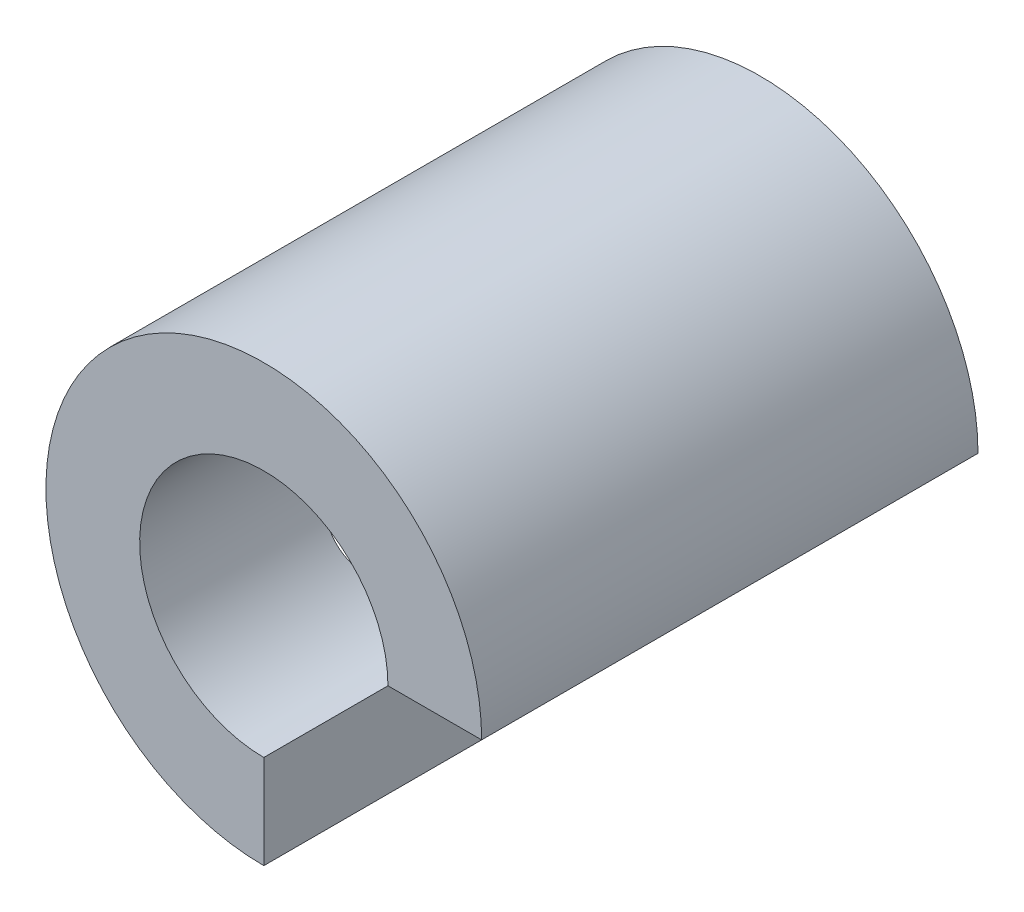
ISO-10303-21;
HEADER;
FILE_DESCRIPTION(('STEP AP214'),'2;1');
FILE_NAME('part.step','',(''),(''),'','','');
FILE_SCHEMA(('AUTOMOTIVE_DESIGN { 1 0 10303 214 1 1 1 1 }'));
ENDSEC;
DATA;
#1=APPLICATION_CONTEXT('core data for automotive mechanical design processes');
#2=APPLICATION_PROTOCOL_DEFINITION('international standard','automotive_design',2000,#1);
#3=PRODUCT_CONTEXT('',#1,'mechanical');
#4=PRODUCT('Part','Part','',(#3));
#5=PRODUCT_RELATED_PRODUCT_CATEGORY('part','',(#4));
#6=PRODUCT_DEFINITION_FORMATION('','',#4);
#7=PRODUCT_DEFINITION_CONTEXT('part definition',#1,'design');
#8=PRODUCT_DEFINITION('design','',#6,#7);
#9=PRODUCT_DEFINITION_SHAPE('','',#8);
#10=(LENGTH_UNIT() NAMED_UNIT(*) SI_UNIT(.MILLI.,.METRE.));
#11=(NAMED_UNIT(*) PLANE_ANGLE_UNIT() SI_UNIT($,.RADIAN.));
#12=(NAMED_UNIT(*) SI_UNIT($,.STERADIAN.) SOLID_ANGLE_UNIT());
#13=UNCERTAINTY_MEASURE_WITH_UNIT(LENGTH_MEASURE(1.E-05),#10,'distance_accuracy_value','');
#14=(GEOMETRIC_REPRESENTATION_CONTEXT(3) GLOBAL_UNCERTAINTY_ASSIGNED_CONTEXT((#13)) GLOBAL_UNIT_ASSIGNED_CONTEXT((#10,
#11,#12)) REPRESENTATION_CONTEXT('',''));
#15=CARTESIAN_POINT('',(0.,0.,0.));
#16=DIRECTION('',(0.,0.,1.));
#17=DIRECTION('',(1.,0.,0.));
#18=AXIS2_PLACEMENT_3D('',#15,#16,#17);
#19=CARTESIAN_POINT('',(0.,0.,2.54));
#20=DIRECTION('',(0.,0.,-1.));
#21=DIRECTION('',(-1.,0.,0.));
#22=AXIS2_PLACEMENT_3D('',#19,#20,#21);
#23=CYLINDRICAL_SURFACE('',#22,1.11496307408743);
#24=CARTESIAN_POINT('',(-0.650054968485564,-0.905853848325279,1.2662797260811));
#25=CARTESIAN_POINT('',(-0.650054399553323,-0.905854005474479,1.24475952003127));
#26=CARTESIAN_POINT('',(-0.651586031238395,-0.904760918163993,1.22324239554398));
#27=CARTESIAN_POINT('',(-0.657596895678824,-0.900401316282277,1.18085164500018));
#28=CARTESIAN_POINT('',(-0.662076290361271,-0.89713468231325,1.15997805436035));
#29=CARTESIAN_POINT('',(-0.673661198554835,-0.888467734145884,1.11949670803127));
#30=CARTESIAN_POINT('',(-0.680760968264163,-0.883072084925903,1.0998862930984));
#31=CARTESIAN_POINT('',(-0.69716165625322,-0.870181994514345,1.06234878815626));
#32=CARTESIAN_POINT('',(-0.706463159473504,-0.8626869954856,1.04442214725072));
#33=CARTESIAN_POINT('',(-0.727200658964764,-0.845288103339899,1.00995980579885));
#34=CARTESIAN_POINT('',(-0.738708004467765,-0.835298736114703,0.993510170422486));
#35=CARTESIAN_POINT('',(-0.763026931016561,-0.813143804512611,0.963246523332104));
#36=CARTESIAN_POINT('',(-0.775838755609098,-0.800977833440746,0.949433005170968));
#37=CARTESIAN_POINT('',(-0.802598776222119,-0.77417481542172,0.924430560730324));
#38=CARTESIAN_POINT('',(-0.816569616348962,-0.75947418709649,0.913333596720354));
#39=CARTESIAN_POINT('',(-0.844664459209266,-0.728098323125537,0.894691341039191));
#40=CARTESIAN_POINT('',(-0.858788413060455,-0.711423701747294,0.887144948117816));
#41=CARTESIAN_POINT('',(-0.886035537527678,-0.677158589964064,0.876115167773703));
#42=CARTESIAN_POINT('',(-0.899176230781452,-0.659629720668769,0.872483956547606));
#43=CARTESIAN_POINT('',(-0.924548130244183,-0.623569438322725,0.868915673409587));
#44=CARTESIAN_POINT('',(-0.936779602072252,-0.605038320822596,0.868977518331309));
#45=CARTESIAN_POINT('',(-0.959432900538969,-0.568396671746801,0.872703881598774));
#46=CARTESIAN_POINT('',(-0.969911139348529,-0.550304298956718,0.876207435131451));
#47=CARTESIAN_POINT('',(-0.989479941943483,-0.51428821320269,0.886449158577885));
#48=CARTESIAN_POINT('',(-0.998570408889185,-0.496364512090589,0.89318755408532));
#49=CARTESIAN_POINT('',(-1.01539230031323,-0.460988566176963,0.909791273344588));
#50=CARTESIAN_POINT('',(-1.02310294294199,-0.443546418841754,0.919699005147482));
#51=CARTESIAN_POINT('',(-1.03702903125615,-0.409932857726817,0.942323924702395));
#52=CARTESIAN_POINT('',(-1.04324402200571,-0.39376183159153,0.955041965021574));
#53=CARTESIAN_POINT('',(-1.05456884807807,-0.362381380385495,0.983719087545649));
#54=CARTESIAN_POINT('',(-1.05960230362103,-0.347268873688827,0.999814593365299));
#55=CARTESIAN_POINT('',(-1.06828234423852,-0.319572600681712,1.03438672895389));
#56=CARTESIAN_POINT('',(-1.07192864861677,-0.306989346419602,1.05286383963967));
#57=CARTESIAN_POINT('',(-1.07806866693969,-0.284688126746987,1.09211443189409));
#58=CARTESIAN_POINT('',(-1.08054012941429,-0.275026649679612,1.11292367103382));
#59=CARTESIAN_POINT('',(-1.08439812691998,-0.259401057128807,1.15597983739476));
#60=CARTESIAN_POINT('',(-1.08578519448416,-0.253435127106685,1.17822605311581));
#61=CARTESIAN_POINT('',(-1.08754685946107,-0.245762669436232,1.22231999731639));
#62=CARTESIAN_POINT('',(-1.08796911386227,-0.243855985728074,1.24413097894656));
#63=CARTESIAN_POINT('',(-1.0879777238045,-0.243818077261686,1.28775374539174));
#64=CARTESIAN_POINT('',(-1.0875642598922,-0.24568603703815,1.3095655290155));
#65=CARTESIAN_POINT('',(-1.08590188279323,-0.252927668087009,1.3516339741616));
#66=CARTESIAN_POINT('',(-1.0846879857948,-0.258154180067101,1.37191771176143));
#67=CARTESIAN_POINT('',(-1.08137442248345,-0.27169888462339,1.41134681907417));
#68=CARTESIAN_POINT('',(-1.07927458581435,-0.280017671772521,1.43049196904129));
#69=CARTESIAN_POINT('',(-1.07397484342799,-0.299712968692054,1.46784273172349));
#70=CARTESIAN_POINT('',(-1.07073908132697,-0.311186116718256,1.48599218404534));
#71=CARTESIAN_POINT('',(-1.06302962298764,-0.336580618012825,1.52019743792302));
#72=CARTESIAN_POINT('',(-1.05855551365684,-0.350502787669171,1.53625253820301));
#73=CARTESIAN_POINT('',(-1.04792572945384,-0.38114475456781,1.56674574992975));
#74=CARTESIAN_POINT('',(-1.04168982628784,-0.397977654888748,1.58104269651956));
#75=CARTESIAN_POINT('',(-1.02752980545295,-0.433226737523331,1.60651370342622));
#76=CARTESIAN_POINT('',(-1.01960571793224,-0.451642891559183,1.61768781950343));
#77=CARTESIAN_POINT('',(-1.00206856544476,-0.489316052960541,1.63650592157421));
#78=CARTESIAN_POINT('',(-0.992464537528204,-0.508568166538103,1.64416803936591));
#79=CARTESIAN_POINT('',(-0.97163319705397,-0.547315688907371,1.65575390192464));
#80=CARTESIAN_POINT('',(-0.960406565247398,-0.566810992551993,1.65967920922837));
#81=CARTESIAN_POINT('',(-0.937222041012344,-0.60433276497677,1.66352431579841));
#82=CARTESIAN_POINT('',(-0.925334542850654,-0.622382287970191,1.66364557100399));
#83=CARTESIAN_POINT('',(-0.900688591524331,-0.657543545457394,1.66038734106127));
#84=CARTESIAN_POINT('',(-0.88793022659965,-0.674655374646518,1.65700821009671));
#85=CARTESIAN_POINT('',(-0.862252827564204,-0.707165908746548,1.64698351184249));
#86=CARTESIAN_POINT('',(-0.849342245659756,-0.722592237614001,1.64040530924017));
#87=CARTESIAN_POINT('',(-0.823578569646634,-0.751825129426127,1.62423388765974));
#88=CARTESIAN_POINT('',(-0.810725486754628,-0.765631388544385,1.61464010437945));
#89=CARTESIAN_POINT('',(-0.785054619007093,-0.791949112132636,1.59227175959098));
#90=CARTESIAN_POINT('',(-0.772258709856349,-0.804386923126801,1.5793855468749));
#91=CARTESIAN_POINT('',(-0.747784172767926,-0.827189082349729,1.55098048148509));
#92=CARTESIAN_POINT('',(-0.73610592758641,-0.837552721572302,1.53546073193793));
#93=CARTESIAN_POINT('',(-0.71389881372581,-0.856571637306029,1.5013724396154));
#94=CARTESIAN_POINT('',(-0.703448200317574,-0.865125594690613,1.48269600392123));
#95=CARTESIAN_POINT('',(-0.684954563392092,-0.879840992942437,1.44331378988596));
#96=CARTESIAN_POINT('',(-0.676911352036613,-0.886002620483051,1.42260817003995));
#97=CARTESIAN_POINT('',(-0.66375984215327,-0.895898436703641,1.37968937473025));
#98=CARTESIAN_POINT('',(-0.658656193440444,-0.899628780786667,1.35747387263606));
#99=CARTESIAN_POINT('',(-0.65180488727667,-0.904605790779123,1.31226405711102));
#100=CARTESIAN_POINT('',(-0.650055576285683,-0.90585368044008,1.28927013309976));
#101=CARTESIAN_POINT('',(-0.650054968485564,-0.905853848325279,1.2662797260811));
#102=B_SPLINE_CURVE_WITH_KNOTS('',3,(#24,#25,#26,#27,#28,#29,#30,#31,#32,#33,#34,#35,#36,#37,
#38,#39,#40,#41,#42,#43,#44,#45,#46,#47,#48,#49,#50,#51,#52,#53,#54,#55,#56,#57,#58,#59,#60,#61,
#62,#63,#64,#65,#66,#67,#68,#69,#70,#71,#72,#73,#74,#75,#76,#77,#78,#79,#80,#81,#82,#83,#84,#85,
#86,#87,#88,#89,#90,#91,#92,#93,#94,#95,#96,#97,#98,#99,#100,#101),.UNSPECIFIED.,.T.,.F.,(4,2,2,
2,2,2,2,2,2,2,2,2,2,2,2,2,2,2,2,2,2,2,2,2,2,2,2,2,2,2,2,2,2,2,2,2,2,2,4),(0.,0.0644752287288314,
0.128953999519144,0.193292265693649,0.257647644013652,0.324616832542832,0.391598547251718,
0.460605067568644,0.529590170592666,0.595868074877446,0.66212654007423,0.725426892598957,
0.788731660249532,0.852921655809699,0.917131151577793,0.984756432423906,1.05239539028078,
1.12126887735278,1.19010852021351,1.25546666171818,1.32081068490968,1.38347051209786,
1.44614239355755,1.51100294322,1.57588515543771,1.64440579832544,1.71292521765046,
1.7810867850289,1.84921983830627,1.91373822922128,1.97825009253293,2.04145874316272,
2.10467922900418,2.17042251471574,2.23618823496415,2.30499904371171,2.3738044820758,
2.44271846042553,2.51159845849176),.UNSPECIFIED.);
#103=CARTESIAN_POINT('',(-0.650054968485564,-0.905853848325279,1.2662797260811));
#104=VERTEX_POINT('',#103);
#105=EDGE_CURVE('E11',#104,#104,#102,.T.);
#106=ORIENTED_EDGE('',*,*,#105,.T.);
#107=EDGE_LOOP('',(#106));
#108=FACE_BOUND('',#107,.T.);
#109=CARTESIAN_POINT('',(0.,0.,0.));
#110=DIRECTION('',(0.,0.,1.));
#111=DIRECTION('',(1.,0.,0.));
#112=AXIS2_PLACEMENT_3D('',#109,#110,#111);
#113=CIRCLE('',#112,1.11496307408743);
#114=CARTESIAN_POINT('',(1.11496307408743,0.,0.));
#115=VERTEX_POINT('',#114);
#116=CARTESIAN_POINT('',(0.,-1.11496307408743,0.));
#117=VERTEX_POINT('',#116);
#118=EDGE_CURVE('E109',#115,#117,#113,.T.);
#119=ORIENTED_EDGE('',*,*,#118,.T.);
#120=DIRECTION('',(0.,0.,-1.));
#121=VECTOR('',#120,1.);
#122=CARTESIAN_POINT('',(0.,-1.11496307408743,2.54));
#123=LINE('',#122,#121);
#124=CARTESIAN_POINT('',(0.,-1.11496307408743,2.54));
#125=VERTEX_POINT('',#124);
#126=EDGE_CURVE('E51',#125,#117,#123,.T.);
#127=ORIENTED_EDGE('',*,*,#126,.F.);
#128=CARTESIAN_POINT('',(0.,0.,2.54));
#129=DIRECTION('',(0.,0.,1.));
#130=DIRECTION('',(1.,0.,0.));
#131=AXIS2_PLACEMENT_3D('',#128,#129,#130);
#132=CIRCLE('',#131,1.11496307408743);
#133=CARTESIAN_POINT('',(1.11496307408743,0.,2.54));
#134=VERTEX_POINT('',#133);
#135=EDGE_CURVE('E95',#134,#125,#132,.T.);
#136=ORIENTED_EDGE('',*,*,#135,.F.);
#137=DIRECTION('',(0.,0.,-1.));
#138=VECTOR('',#137,1.);
#139=CARTESIAN_POINT('',(1.11496307408743,0.,2.54));
#140=LINE('',#139,#138);
#141=EDGE_CURVE('E105',#134,#115,#140,.T.);
#142=ORIENTED_EDGE('',*,*,#141,.T.);
#143=EDGE_LOOP('',(#119,#127,#136,#142));
#144=FACE_BOUND('',#143,.T.);
#145=ADVANCED_FACE('F38',(#108,#144),#23,.T.);
#146=CARTESIAN_POINT('',(0.,-1.11496307408743,2.54));
#147=DIRECTION('',(-1.,0.,0.));
#148=DIRECTION('',(0.,0.,1.));
#149=AXIS2_PLACEMENT_3D('',#146,#147,#148);
#150=PLANE('',#149);
#151=DIRECTION('',(0.,1.,0.));
#152=VECTOR('',#151,1.);
#153=CARTESIAN_POINT('',(0.,-1.11496307408743,0.));
#154=LINE('',#153,#152);
#155=CARTESIAN_POINT('',(0.,-0.635351917,0.));
#156=VERTEX_POINT('',#155);
#157=EDGE_CURVE('E100',#117,#156,#154,.T.);
#158=ORIENTED_EDGE('',*,*,#157,.T.);
#159=DIRECTION('',(0.,0.,-1.));
#160=VECTOR('',#159,1.);
#161=CARTESIAN_POINT('',(0.,-0.635351917,2.54));
#162=LINE('',#161,#160);
#163=CARTESIAN_POINT('',(0.,-0.635351917,2.54));
#164=VERTEX_POINT('',#163);
#165=EDGE_CURVE('E98',#164,#156,#162,.T.);
#166=ORIENTED_EDGE('',*,*,#165,.F.);
#167=DIRECTION('',(0.,1.,0.));
#168=VECTOR('',#167,1.);
#169=CARTESIAN_POINT('',(0.,-1.11496307408743,2.54));
#170=LINE('',#169,#168);
#171=EDGE_CURVE('E90',#125,#164,#170,.T.);
#172=ORIENTED_EDGE('',*,*,#171,.F.);
#173=ORIENTED_EDGE('',*,*,#126,.T.);
#174=EDGE_LOOP('',(#158,#166,#172,#173));
#175=FACE_BOUND('',#174,.T.);
#176=ADVANCED_FACE('F99',(#175),#150,.F.);
#177=CARTESIAN_POINT('',(0.,0.,2.54));
#178=DIRECTION('',(0.,0.,-1.));
#179=DIRECTION('',(-1.,0.,0.));
#180=AXIS2_PLACEMENT_3D('',#177,#178,#179);
#181=CYLINDRICAL_SURFACE('',#180,0.635351917);
#182=CARTESIAN_POINT('',(-0.194846151008928,-0.604737162635621,1.2662797260811));
#183=CARTESIAN_POINT('',(-0.1948493285247,-0.604737226254664,1.28600575579285));
#184=CARTESIAN_POINT('',(-0.196664481329038,-0.604160529559254,1.30576278995406));
#185=CARTESIAN_POINT('',(-0.203691420444811,-0.601825946138133,1.3446114117425));
#186=CARTESIAN_POINT('',(-0.208912456860977,-0.600064842253698,1.36370103754873));
#187=CARTESIAN_POINT('',(-0.222105971945253,-0.595305962604907,1.40053474752498));
#188=CARTESIAN_POINT('',(-0.230054591058662,-0.592318868190438,1.41828892372852));
#189=CARTESIAN_POINT('',(-0.248071875713025,-0.585001530168175,1.45236861671032));
#190=CARTESIAN_POINT('',(-0.258140594883913,-0.580671252581983,1.46869409733358));
#191=CARTESIAN_POINT('',(-0.281289043059895,-0.569853152987441,1.50185852230062));
#192=CARTESIAN_POINT('',(-0.294591449621908,-0.563153986732719,1.51847317786389));
#193=CARTESIAN_POINT('',(-0.32250805106644,-0.547645923756379,1.54948841358866));
#194=CARTESIAN_POINT('',(-0.337123370708368,-0.53883520710482,1.5638870661161));
#195=CARTESIAN_POINT('',(-0.368846457462,-0.517715505738222,1.59178047721952));
#196=CARTESIAN_POINT('',(-0.386042390152628,-0.505112971994385,1.60495743045806));
#197=CARTESIAN_POINT('',(-0.420390706822426,-0.476902250429657,1.62765367704406));
#198=CARTESIAN_POINT('',(-0.43754311708721,-0.461297058932642,1.63717658859511));
#199=CARTESIAN_POINT('',(-0.469153481863624,-0.428981177075799,1.65125280539326));
#200=CARTESIAN_POINT('',(-0.483708151000276,-0.412543811391465,1.65621266537083));
#201=CARTESIAN_POINT('',(-0.511297776841926,-0.377805124872958,1.66240594988504));
#202=CARTESIAN_POINT('',(-0.524334314853727,-0.359505781424192,1.66364328584126));
#203=CARTESIAN_POINT('',(-0.546714633530162,-0.324271190370245,1.66240399741652));
#204=CARTESIAN_POINT('',(-0.556319172386047,-0.307481965423775,1.66040304434594));
#205=CARTESIAN_POINT('',(-0.573767139794075,-0.273545710998305,1.65366237818873));
#206=CARTESIAN_POINT('',(-0.581610435171564,-0.256398654569306,1.64892245809461));
#207=CARTESIAN_POINT('',(-0.595508865946396,-0.222222688017598,1.63690967702954));
#208=CARTESIAN_POINT('',(-0.601559264250036,-0.205194204946341,1.62963021465531));
#209=CARTESIAN_POINT('',(-0.611948173984357,-0.171751323366705,1.61281090276224));
#210=CARTESIAN_POINT('',(-0.616286294080544,-0.155337066012227,1.60327053731926));
#211=CARTESIAN_POINT('',(-0.623891977582648,-0.121520611414023,1.58086937042636));
#212=CARTESIAN_POINT('',(-0.626959269312585,-0.104249474044431,1.56774316474681));
#213=CARTESIAN_POINT('',(-0.631542214722298,-0.0714270777299253,1.53922795840137));
#214=CARTESIAN_POINT('',(-0.633055589425079,-0.0558783746171687,1.52383567198991));
#215=CARTESIAN_POINT('',(-0.635064748092717,-0.0251306714710348,1.48886590718733));
#216=CARTESIAN_POINT('',(-0.635402126701693,-0.0102415962981704,1.46900441534594));
#217=CARTESIAN_POINT('',(-0.635289627742919,0.0157821377498787,1.42696357319019));
#218=CARTESIAN_POINT('',(-0.634841209124868,0.0269237086590192,1.4047885900878));
#219=CARTESIAN_POINT('',(-0.633988365080569,0.0421039631203823,1.3646850650241));
#220=CARTESIAN_POINT('',(-0.633603350414115,0.0472398230914708,1.34717215057947));
#221=CARTESIAN_POINT('',(-0.633021055733301,0.0544992847831617,1.31153736757629));
#222=CARTESIAN_POINT('',(-0.632823519919328,0.0566269928296252,1.29341636378246));
#223=CARTESIAN_POINT('',(-0.632729012422419,0.0576753349353923,1.25703817761851));
#224=CARTESIAN_POINT('',(-0.632832725284769,0.0565886646686272,1.23878077927609));
#225=CARTESIAN_POINT('',(-0.63328267950612,0.0513002354534658,1.20272140896679));
#226=CARTESIAN_POINT('',(-0.633629121613916,0.0470958978756746,1.18491982662256));
#227=CARTESIAN_POINT('',(-0.63435339229935,0.0360221132757095,1.15050349952061));
#228=CARTESIAN_POINT('',(-0.634730619268511,0.0291970907950828,1.13387416801364));
#229=CARTESIAN_POINT('',(-0.635262386517908,0.0132999623918932,1.10173179575687));
#230=CARTESIAN_POINT('',(-0.63541684758465,0.00422705848665499,1.08621915395362));
#231=CARTESIAN_POINT('',(-0.635217105230522,-0.0176845819263577,1.05361627152174));
#232=CARTESIAN_POINT('',(-0.634760528210075,-0.0309113789844088,1.03678744580905));
#233=CARTESIAN_POINT('',(-0.632725279123549,-0.0594654065205735,1.00507681929089));
#234=CARTESIAN_POINT('',(-0.63114543850075,-0.0747948109737421,0.990197065255949));
#235=CARTESIAN_POINT('',(-0.626098899909536,-0.109681698985718,0.960386713662761));
#236=CARTESIAN_POINT('',(-0.622370967781898,-0.12952334947712,0.945828156169959));
#237=CARTESIAN_POINT('',(-0.612357759751071,-0.17069857550121,0.920069119572753));
#238=CARTESIAN_POINT('',(-0.606073694092659,-0.192031441039778,0.90886705563244));
#239=CARTESIAN_POINT('',(-0.591066060953894,-0.234051399291165,0.890921396458448));
#240=CARTESIAN_POINT('',(-0.582511378020177,-0.254700504889676,0.883950726062485));
#241=CARTESIAN_POINT('',(-0.562805396503281,-0.295697284334827,0.873902756792153));
#242=CARTESIAN_POINT('',(-0.551657706928367,-0.316045335708575,0.870820084460949));
#243=CARTESIAN_POINT('',(-0.528897499629215,-0.352609981251758,0.868914859085197));
#244=CARTESIAN_POINT('',(-0.517595692832943,-0.36899345892517,0.869531348013088));
#245=CARTESIAN_POINT('',(-0.493709260687213,-0.400389751691527,0.87370864953008));
#246=CARTESIAN_POINT('',(-0.481124692333298,-0.415402627626786,0.877269331353025));
#247=CARTESIAN_POINT('',(-0.455598404335698,-0.443223286651017,0.886975182063277));
#248=CARTESIAN_POINT('',(-0.442683878528107,-0.456089174395428,0.893027194576167));
#249=CARTESIAN_POINT('',(-0.416547615903161,-0.480078264070918,0.907451989239276));
#250=CARTESIAN_POINT('',(-0.40332582742835,-0.491201170499636,0.915825164250916));
#251=CARTESIAN_POINT('',(-0.375628433740076,-0.512751762698658,0.935615692822953));
#252=CARTESIAN_POINT('',(-0.361165265359601,-0.522987188421307,0.947258925747935));
#253=CARTESIAN_POINT('',(-0.332903688241739,-0.541417115707017,0.972775702743514));
#254=CARTESIAN_POINT('',(-0.31910605343154,-0.549609285288671,0.986651765723949));
#255=CARTESIAN_POINT('',(-0.290821957839372,-0.565146575355101,1.01854888594215));
#256=CARTESIAN_POINT('',(-0.276522172303979,-0.572200083766184,1.03687907729811));
#257=CARTESIAN_POINT('',(-0.250428386286494,-0.584091982396444,1.07590523880264));
#258=CARTESIAN_POINT('',(-0.238632989312035,-0.58893160886378,1.09659988053553));
#259=CARTESIAN_POINT('',(-0.220859576999811,-0.595787834556966,1.13523223306301));
#260=CARTESIAN_POINT('',(-0.214172634562385,-0.598191262245331,1.15277484443057));
#261=CARTESIAN_POINT('',(-0.203583878451038,-0.601878620822916,1.18876800561649));
#262=CARTESIAN_POINT('',(-0.199673240704329,-0.603166101492796,1.20721547778464));
#263=CARTESIAN_POINT('',(-0.196522719220105,-0.604194818491947,1.2325601907809));
#264=CARTESIAN_POINT('',(-0.195895577346282,-0.60439823004598,1.23928536596286));
#265=CARTESIAN_POINT('',(-0.19505669690726,-0.604669408188814,1.25276571810845));
#266=CARTESIAN_POINT('',(-0.194845062281498,-0.604737140837524,1.25952090215538));
#267=CARTESIAN_POINT('',(-0.194846151008928,-0.604737162635621,1.2662797260811));
#268=B_SPLINE_CURVE_WITH_KNOTS('',3,(#182,#183,#184,#185,#186,#187,#188,#189,#190,#191,#192,
#193,#194,#195,#196,#197,#198,#199,#200,#201,#202,#203,#204,#205,#206,#207,#208,#209,#210,#211,
#212,#213,#214,#215,#216,#217,#218,#219,#220,#221,#222,#223,#224,#225,#226,#227,#228,#229,#230,
#231,#232,#233,#234,#235,#236,#237,#238,#239,#240,#241,#242,#243,#244,#245,#246,#247,#248,#249,
#250,#251,#252,#253,#254,#255,#256,#257,#258,#259,#260,#261,#262,#263,#264,#265,#266,#267),
.UNSPECIFIED.,.T.,.F.,(4,2,2,2,2,2,2,2,2,2,2,2,2,2,2,2,2,2,2,2,2,2,2,2,2,2,2,2,2,2,2,2,2,2,2,2,
2,2,2,2,2,2,4),(0.,0.059147070201188,0.118455451640614,0.177257726612126,0.236061489221446,
0.30274423404711,0.369484660259717,0.444264470593809,0.518970042276073,0.586086917355289,
0.653133245110627,0.711191039012886,0.769253221419674,0.827467471992465,0.885695019511683,
0.951165002821941,1.01673086794911,1.09084549391966,1.16482266079255,1.21935760214584,
1.27381802759026,1.32840230344544,1.38303177650064,1.43677339767851,1.49053412417191,
1.55452372446832,1.61857999219218,1.69287510431371,1.76713508102305,1.83694197523095,
1.90665228584003,1.96608744379644,2.02551996208552,2.08290723610966,2.14030422898179,
2.20366386275887,2.26709548176,2.33965658773493,2.41217712543803,2.46874310402602,
2.52512848122914,2.54538925723834,2.56565510084976),.UNSPECIFIED.);
#269=CARTESIAN_POINT('',(-0.194846151008928,-0.604737162635621,1.2662797260811));
#270=VERTEX_POINT('',#269);
#271=EDGE_CURVE('E112',#270,#270,#268,.T.);
#272=ORIENTED_EDGE('',*,*,#271,.T.);
#273=EDGE_LOOP('',(#272));
#274=FACE_BOUND('',#273,.T.);
#275=CARTESIAN_POINT('',(0.,0.,0.));
#276=DIRECTION('',(0.,0.,-1.));
#277=DIRECTION('',(1.,0.,0.));
#278=AXIS2_PLACEMENT_3D('',#275,#276,#277);
#279=CIRCLE('',#278,0.635351917);
#280=CARTESIAN_POINT('',(0.635351917,0.,0.));
#281=VERTEX_POINT('',#280);
#282=EDGE_CURVE('E76',#156,#281,#279,.T.);
#283=ORIENTED_EDGE('',*,*,#282,.T.);
#284=DIRECTION('',(0.,0.,-1.));
#285=VECTOR('',#284,1.);
#286=CARTESIAN_POINT('',(0.635351917,0.,2.54));
#287=LINE('',#286,#285);
#288=CARTESIAN_POINT('',(0.635351917,0.,2.54));
#289=VERTEX_POINT('',#288);
#290=EDGE_CURVE('E101',#289,#281,#287,.T.);
#291=ORIENTED_EDGE('',*,*,#290,.F.);
#292=CARTESIAN_POINT('',(0.,0.,2.54));
#293=DIRECTION('',(0.,0.,-1.));
#294=DIRECTION('',(1.,0.,0.));
#295=AXIS2_PLACEMENT_3D('',#292,#293,#294);
#296=CIRCLE('',#295,0.635351917);
#297=EDGE_CURVE('E93',#164,#289,#296,.T.);
#298=ORIENTED_EDGE('',*,*,#297,.F.);
#299=ORIENTED_EDGE('',*,*,#165,.T.);
#300=EDGE_LOOP('',(#283,#291,#298,#299));
#301=FACE_BOUND('',#300,.T.);
#302=ADVANCED_FACE('F103',(#274,#301),#181,.F.);
#303=CARTESIAN_POINT('',(1.11496307408743,0.,2.54));
#304=DIRECTION('',(0.,1.,0.));
#305=DIRECTION('',(0.,0.,1.));
#306=AXIS2_PLACEMENT_3D('',#303,#304,#305);
#307=PLANE('',#306);
#308=DIRECTION('',(1.,0.,0.));
#309=VECTOR('',#308,1.);
#310=CARTESIAN_POINT('',(1.11496307408743,0.,0.));
#311=LINE('',#310,#309);
#312=EDGE_CURVE('E82',#281,#115,#311,.T.);
#313=ORIENTED_EDGE('',*,*,#312,.T.);
#314=ORIENTED_EDGE('',*,*,#141,.F.);
#315=DIRECTION('',(1.,0.,0.));
#316=VECTOR('',#315,1.);
#317=CARTESIAN_POINT('',(1.11496307408743,0.,2.54));
#318=LINE('',#317,#316);
#319=EDGE_CURVE('E59',#289,#134,#318,.T.);
#320=ORIENTED_EDGE('',*,*,#319,.F.);
#321=ORIENTED_EDGE('',*,*,#290,.T.);
#322=EDGE_LOOP('',(#313,#314,#320,#321));
#323=FACE_BOUND('',#322,.T.);
#324=ADVANCED_FACE('F129',(#323),#307,.F.);
#325=CARTESIAN_POINT('',(0.,0.,2.54));
#326=DIRECTION('',(0.,0.,1.));
#327=DIRECTION('',(1.,0.,0.));
#328=AXIS2_PLACEMENT_3D('',#325,#326,#327);
#329=PLANE('',#328);
#330=ORIENTED_EDGE('',*,*,#135,.T.);
#331=ORIENTED_EDGE('',*,*,#171,.T.);
#332=ORIENTED_EDGE('',*,*,#297,.T.);
#333=ORIENTED_EDGE('',*,*,#319,.T.);
#334=EDGE_LOOP('',(#330,#331,#332,#333));
#335=FACE_BOUND('',#334,.T.);
#336=ADVANCED_FACE('F91',(#335),#329,.T.);
#337=CARTESIAN_POINT('',(0.,0.,0.));
#338=DIRECTION('',(0.,0.,1.));
#339=DIRECTION('',(1.,0.,0.));
#340=AXIS2_PLACEMENT_3D('',#337,#338,#339);
#341=PLANE('',#340);
#342=ORIENTED_EDGE('',*,*,#118,.F.);
#343=ORIENTED_EDGE('',*,*,#312,.F.);
#344=ORIENTED_EDGE('',*,*,#282,.F.);
#345=ORIENTED_EDGE('',*,*,#157,.F.);
#346=EDGE_LOOP('',(#342,#343,#344,#345));
#347=FACE_BOUND('',#346,.T.);
#348=ADVANCED_FACE('F120',(#347),#341,.F.);
#349=CARTESIAN_POINT('',(-0.929920595294194,-0.615134410536573,1.2662797260811));
#350=DIRECTION('',(-0.834037123655699,-0.551708325443915,0.));
#351=DIRECTION('',(0.551708325443915,-0.834037123655699,0.));
#352=AXIS2_PLACEMENT_3D('',#349,#350,#351);
#353=CYLINDRICAL_SURFACE('',#352,0.396874999999994);
#354=ORIENTED_EDGE('',*,*,#105,.F.);
#355=EDGE_LOOP('',(#354));
#356=FACE_BOUND('',#355,.T.);
#357=ORIENTED_EDGE('',*,*,#271,.F.);
#358=EDGE_LOOP('',(#357));
#359=FACE_BOUND('',#358,.T.);
#360=ADVANCED_FACE('F122',(#356,#359),#353,.F.);
#361=CLOSED_SHELL('',(#145,#176,#302,#324,#336,#348,#360));
#362=MANIFOLD_SOLID_BREP('B2',#361);
#363=ADVANCED_BREP_SHAPE_REPRESENTATION('',(#18,#362),#14);
#364=SHAPE_DEFINITION_REPRESENTATION(#9,#363);
ENDSEC;
END-ISO-10303-21;
